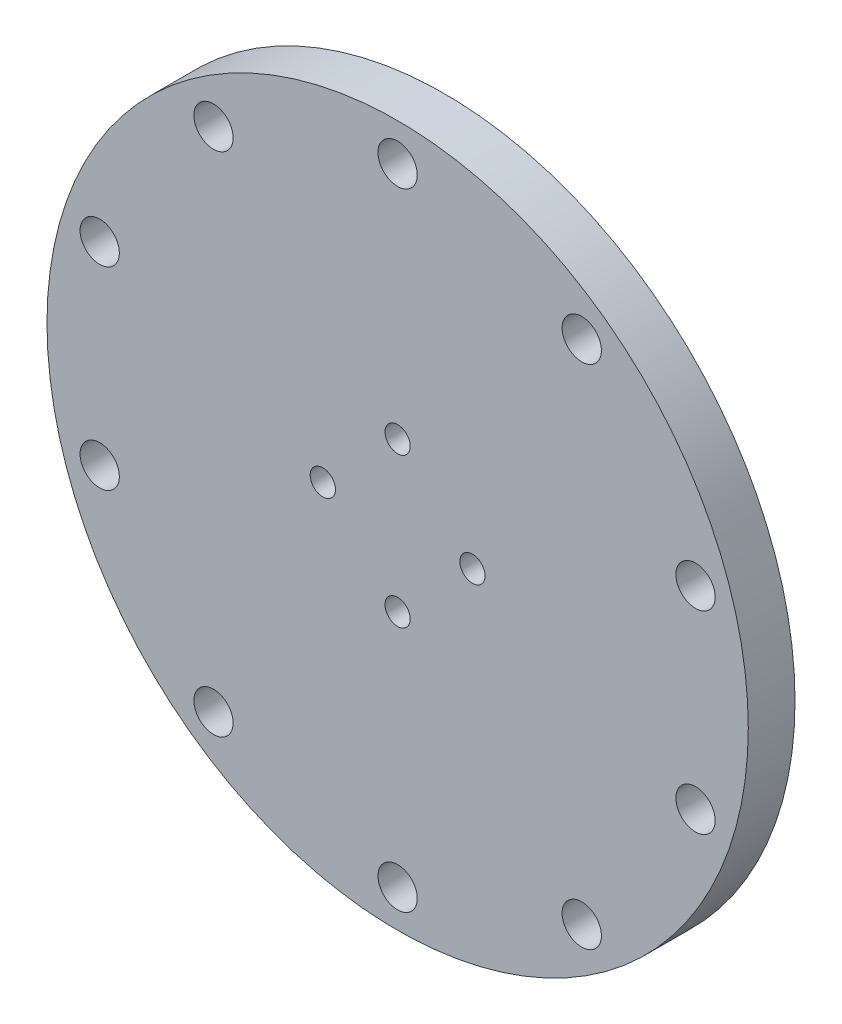
ISO-10303-21;
HEADER;
FILE_DESCRIPTION(('STEP AP214'),'2;1');
FILE_NAME('part.step','',(''),(''),'','','');
FILE_SCHEMA(('AUTOMOTIVE_DESIGN { 1 0 10303 214 1 1 1 1 }'));
ENDSEC;
DATA;
#1=APPLICATION_CONTEXT('core data for automotive mechanical design processes');
#2=APPLICATION_PROTOCOL_DEFINITION('international standard','automotive_design',2000,#1);
#3=PRODUCT_CONTEXT('',#1,'mechanical');
#4=PRODUCT('Part','Part','',(#3));
#5=PRODUCT_RELATED_PRODUCT_CATEGORY('part','',(#4));
#6=PRODUCT_DEFINITION_FORMATION('','',#4);
#7=PRODUCT_DEFINITION_CONTEXT('part definition',#1,'design');
#8=PRODUCT_DEFINITION('design','',#6,#7);
#9=PRODUCT_DEFINITION_SHAPE('','',#8);
#10=(LENGTH_UNIT() NAMED_UNIT(*) SI_UNIT(.MILLI.,.METRE.));
#11=(NAMED_UNIT(*) PLANE_ANGLE_UNIT() SI_UNIT($,.RADIAN.));
#12=(NAMED_UNIT(*) SI_UNIT($,.STERADIAN.) SOLID_ANGLE_UNIT());
#13=UNCERTAINTY_MEASURE_WITH_UNIT(LENGTH_MEASURE(1.E-05),#10,'distance_accuracy_value','');
#14=(GEOMETRIC_REPRESENTATION_CONTEXT(3) GLOBAL_UNCERTAINTY_ASSIGNED_CONTEXT((#13)) GLOBAL_UNIT_ASSIGNED_CONTEXT((#10,
#11,#12)) REPRESENTATION_CONTEXT('',''));
#15=CARTESIAN_POINT('',(0.,0.,0.));
#16=DIRECTION('',(0.,0.,1.));
#17=DIRECTION('',(1.,0.,0.));
#18=AXIS2_PLACEMENT_3D('',#15,#16,#17);
#19=CARTESIAN_POINT('',(0.,0.,0.));
#20=DIRECTION('',(0.,0.,1.));
#21=DIRECTION('',(1.,0.,0.));
#22=AXIS2_PLACEMENT_3D('',#19,#20,#21);
#23=PLANE('',#22);
#24=CARTESIAN_POINT('',(4.6785849940498E-13,0.,0.));
#25=DIRECTION('',(0.,0.,1.));
#26=DIRECTION('',(1.,0.,0.));
#27=AXIS2_PLACEMENT_3D('',#24,#25,#26);
#28=CIRCLE('',#27,23.5);
#29=CARTESIAN_POINT('',(23.5000000000005,0.,0.));
#30=VERTEX_POINT('',#29);
#31=EDGE_CURVE('E10',#30,#30,#28,.F.);
#32=ORIENTED_EDGE('',*,*,#31,.T.);
#33=EDGE_LOOP('',(#32));
#34=FACE_BOUND('',#33,.T.);
#35=CARTESIAN_POINT('',(0.,0.,0.));
#36=DIRECTION('',(0.,0.,1.));
#37=DIRECTION('',(1.,0.,0.));
#38=AXIS2_PLACEMENT_3D('',#35,#36,#37);
#39=CIRCLE('',#38,17.35);
#40=CARTESIAN_POINT('',(17.35,0.,0.));
#41=VERTEX_POINT('',#40);
#42=EDGE_CURVE('E46',#41,#41,#39,.T.);
#43=ORIENTED_EDGE('',*,*,#42,.T.);
#44=EDGE_LOOP('',(#43));
#45=FACE_BOUND('',#44,.T.);
#46=ADVANCED_FACE('F39',(#34,#45),#23,.F.);
#47=CARTESIAN_POINT('',(0.,0.,3.));
#48=DIRECTION('',(0.,0.,1.));
#49=DIRECTION('',(1.,0.,0.));
#50=AXIS2_PLACEMENT_3D('',#47,#48,#49);
#51=PLANE('',#50);
#52=CARTESIAN_POINT('',(-31.8603932958875,10.3520693115611,3.));
#53=DIRECTION('',(0.,0.,1.));
#54=DIRECTION('',(1.,0.,0.));
#55=AXIS2_PLACEMENT_3D('',#52,#53,#54);
#56=CIRCLE('',#55,2.1);
#57=CARTESIAN_POINT('',(-29.7603932958875,10.3520693115611,3.));
#58=VERTEX_POINT('',#57);
#59=EDGE_CURVE('E92',#58,#58,#56,.T.);
#60=ORIENTED_EDGE('',*,*,#59,.F.);
#61=EDGE_LOOP('',(#60));
#62=FACE_BOUND('',#61,.T.);
#63=CARTESIAN_POINT('',(-19.6908059517981,-27.1020693115606,3.));
#64=DIRECTION('',(0.,0.,1.));
#65=DIRECTION('',(1.,0.,0.));
#66=AXIS2_PLACEMENT_3D('',#63,#64,#65);
#67=CIRCLE('',#66,2.09999999999999);
#68=CARTESIAN_POINT('',(-17.5908059517981,-27.1020693115606,3.));
#69=VERTEX_POINT('',#68);
#70=EDGE_CURVE('E86',#69,#69,#67,.T.);
#71=ORIENTED_EDGE('',*,*,#70,.F.);
#72=EDGE_LOOP('',(#71));
#73=FACE_BOUND('',#72,.T.);
#74=CARTESIAN_POINT('',(19.6908059517977,-27.1020693115608,3.));
#75=DIRECTION('',(0.,0.,1.));
#76=DIRECTION('',(1.,0.,0.));
#77=AXIS2_PLACEMENT_3D('',#74,#75,#76);
#78=CIRCLE('',#77,2.09999999999999);
#79=CARTESIAN_POINT('',(21.7908059517977,-27.1020693115608,3.));
#80=VERTEX_POINT('',#79);
#81=EDGE_CURVE('E80',#80,#80,#78,.T.);
#82=ORIENTED_EDGE('',*,*,#81,.F.);
#83=EDGE_LOOP('',(#82));
#84=FACE_BOUND('',#83,.T.);
#85=CARTESIAN_POINT('',(31.8603932958878,10.3520693115602,3.));
#86=DIRECTION('',(0.,0.,1.));
#87=DIRECTION('',(1.,0.,0.));
#88=AXIS2_PLACEMENT_3D('',#85,#86,#87);
#89=CIRCLE('',#88,2.10000000000001);
#90=CARTESIAN_POINT('',(33.9603932958878,10.3520693115602,3.));
#91=VERTEX_POINT('',#90);
#92=EDGE_CURVE('E74',#91,#91,#89,.T.);
#93=ORIENTED_EDGE('',*,*,#92,.F.);
#94=EDGE_LOOP('',(#93));
#95=FACE_BOUND('',#94,.T.);
#96=CARTESIAN_POINT('',(0.,33.5,3.));
#97=DIRECTION('',(0.,0.,1.));
#98=DIRECTION('',(1.,0.,0.));
#99=AXIS2_PLACEMENT_3D('',#96,#97,#98);
#100=CIRCLE('',#99,2.1);
#101=CARTESIAN_POINT('',(2.1,33.5,3.));
#102=VERTEX_POINT('',#101);
#103=EDGE_CURVE('E68',#102,#102,#100,.T.);
#104=ORIENTED_EDGE('',*,*,#103,.F.);
#105=EDGE_LOOP('',(#104));
#106=FACE_BOUND('',#105,.T.);
#107=CARTESIAN_POINT('',(8.,0.,3.));
#108=DIRECTION('',(0.,0.,1.));
#109=DIRECTION('',(1.,0.,0.));
#110=AXIS2_PLACEMENT_3D('',#107,#108,#109);
#111=CIRCLE('',#110,1.35);
#112=CARTESIAN_POINT('',(9.35,0.,3.));
#113=VERTEX_POINT('',#112);
#114=EDGE_CURVE('E62',#113,#113,#111,.T.);
#115=ORIENTED_EDGE('',*,*,#114,.F.);
#116=EDGE_LOOP('',(#115));
#117=FACE_BOUND('',#116,.T.);
#118=CARTESIAN_POINT('',(0.,8.,3.));
#119=DIRECTION('',(0.,0.,1.));
#120=DIRECTION('',(1.,0.,0.));
#121=AXIS2_PLACEMENT_3D('',#118,#119,#120);
#122=CIRCLE('',#121,1.35);
#123=CARTESIAN_POINT('',(1.35,8.,3.));
#124=VERTEX_POINT('',#123);
#125=EDGE_CURVE('E54',#124,#124,#122,.T.);
#126=ORIENTED_EDGE('',*,*,#125,.F.);
#127=EDGE_LOOP('',(#126));
#128=FACE_BOUND('',#127,.T.);
#129=CARTESIAN_POINT('',(0.,0.,3.));
#130=DIRECTION('',(0.,0.,1.));
#131=DIRECTION('',(1.,0.,0.));
#132=AXIS2_PLACEMENT_3D('',#129,#130,#131);
#133=CIRCLE('',#132,37.5);
#134=CARTESIAN_POINT('',(37.5,0.,3.));
#135=VERTEX_POINT('',#134);
#136=EDGE_CURVE('E50',#135,#135,#133,.T.);
#137=ORIENTED_EDGE('',*,*,#136,.T.);
#138=EDGE_LOOP('',(#137));
#139=FACE_BOUND('',#138,.T.);
#140=CARTESIAN_POINT('',(0.,-8.,3.));
#141=DIRECTION('',(0.,0.,1.));
#142=DIRECTION('',(1.,0.,0.));
#143=AXIS2_PLACEMENT_3D('',#140,#141,#142);
#144=CIRCLE('',#143,1.35);
#145=CARTESIAN_POINT('',(1.35,-8.,3.));
#146=VERTEX_POINT('',#145);
#147=EDGE_CURVE('E59',#146,#146,#144,.T.);
#148=ORIENTED_EDGE('',*,*,#147,.F.);
#149=EDGE_LOOP('',(#148));
#150=FACE_BOUND('',#149,.T.);
#151=CARTESIAN_POINT('',(-8.,0.,3.));
#152=DIRECTION('',(0.,0.,1.));
#153=DIRECTION('',(1.,0.,0.));
#154=AXIS2_PLACEMENT_3D('',#151,#152,#153);
#155=CIRCLE('',#154,1.35);
#156=CARTESIAN_POINT('',(-6.65,0.,3.));
#157=VERTEX_POINT('',#156);
#158=EDGE_CURVE('E65',#157,#157,#155,.T.);
#159=ORIENTED_EDGE('',*,*,#158,.F.);
#160=EDGE_LOOP('',(#159));
#161=FACE_BOUND('',#160,.T.);
#162=CARTESIAN_POINT('',(19.6908059517983,27.1020693115605,3.));
#163=DIRECTION('',(0.,0.,1.));
#164=DIRECTION('',(1.,0.,0.));
#165=AXIS2_PLACEMENT_3D('',#162,#163,#164);
#166=CIRCLE('',#165,2.1);
#167=CARTESIAN_POINT('',(21.7908059517983,27.1020693115605,3.));
#168=VERTEX_POINT('',#167);
#169=EDGE_CURVE('E71',#168,#168,#166,.T.);
#170=ORIENTED_EDGE('',*,*,#169,.F.);
#171=EDGE_LOOP('',(#170));
#172=FACE_BOUND('',#171,.T.);
#173=CARTESIAN_POINT('',(31.8603932958876,-10.3520693115609,3.));
#174=DIRECTION('',(0.,0.,1.));
#175=DIRECTION('',(1.,0.,0.));
#176=AXIS2_PLACEMENT_3D('',#173,#174,#175);
#177=CIRCLE('',#176,2.10000000000001);
#178=CARTESIAN_POINT('',(33.9603932958876,-10.3520693115609,3.));
#179=VERTEX_POINT('',#178);
#180=EDGE_CURVE('E77',#179,#179,#177,.T.);
#181=ORIENTED_EDGE('',*,*,#180,.F.);
#182=EDGE_LOOP('',(#181));
#183=FACE_BOUND('',#182,.T.);
#184=CARTESIAN_POINT('',(-2.32452945780892E-13,-33.5,3.));
#185=DIRECTION('',(0.,0.,1.));
#186=DIRECTION('',(1.,0.,0.));
#187=AXIS2_PLACEMENT_3D('',#184,#185,#186);
#188=CIRCLE('',#187,2.09999999999999);
#189=CARTESIAN_POINT('',(2.09999999999976,-33.5,3.));
#190=VERTEX_POINT('',#189);
#191=EDGE_CURVE('E83',#190,#190,#188,.T.);
#192=ORIENTED_EDGE('',*,*,#191,.F.);
#193=EDGE_LOOP('',(#192));
#194=FACE_BOUND('',#193,.T.);
#195=CARTESIAN_POINT('',(-31.8603932958877,-10.3520693115604,3.));
#196=DIRECTION('',(0.,0.,1.));
#197=DIRECTION('',(1.,0.,0.));
#198=AXIS2_PLACEMENT_3D('',#195,#196,#197);
#199=CIRCLE('',#198,2.1);
#200=CARTESIAN_POINT('',(-29.7603932958877,-10.3520693115604,3.));
#201=VERTEX_POINT('',#200);
#202=EDGE_CURVE('E89',#201,#201,#199,.T.);
#203=ORIENTED_EDGE('',*,*,#202,.F.);
#204=EDGE_LOOP('',(#203));
#205=FACE_BOUND('',#204,.T.);
#206=CARTESIAN_POINT('',(-19.6908059517975,27.102069311561,3.));
#207=DIRECTION('',(0.,0.,1.));
#208=DIRECTION('',(1.,0.,0.));
#209=AXIS2_PLACEMENT_3D('',#206,#207,#208);
#210=CIRCLE('',#209,2.09999999999999);
#211=CARTESIAN_POINT('',(-17.5908059517975,27.102069311561,3.));
#212=VERTEX_POINT('',#211);
#213=EDGE_CURVE('E95',#212,#212,#210,.T.);
#214=ORIENTED_EDGE('',*,*,#213,.F.);
#215=EDGE_LOOP('',(#214));
#216=FACE_BOUND('',#215,.T.);
#217=ADVANCED_FACE('F173',(#62,#73,#84,#95,#106,#117,#128,#139,#150,#161,#172,#183,#194,#205,
#216),#51,.T.);
#218=CARTESIAN_POINT('',(0.,0.,3.));
#219=DIRECTION('',(0.,0.,-1.));
#220=DIRECTION('',(-1.,0.,0.));
#221=AXIS2_PLACEMENT_3D('',#218,#219,#220);
#222=CYLINDRICAL_SURFACE('',#221,37.5);
#223=ORIENTED_EDGE('',*,*,#136,.F.);
#224=EDGE_LOOP('',(#223));
#225=FACE_BOUND('',#224,.T.);
#226=CARTESIAN_POINT('',(4.6785849940498E-13,0.,-2.));
#227=DIRECTION('',(0.,0.,-1.));
#228=DIRECTION('',(-1.,0.,0.));
#229=AXIS2_PLACEMENT_3D('',#226,#227,#228);
#230=CIRCLE('',#229,37.4999999999995);
#231=CARTESIAN_POINT('',(-37.4999999999991,0.,-2.));
#232=VERTEX_POINT('',#231);
#233=EDGE_CURVE('E98',#232,#232,#230,.T.);
#234=ORIENTED_EDGE('',*,*,#233,.F.);
#235=EDGE_LOOP('',(#234));
#236=FACE_BOUND('',#235,.T.);
#237=ADVANCED_FACE('F178',(#225,#236),#222,.T.);
#238=CARTESIAN_POINT('',(0.,8.,3.));
#239=DIRECTION('',(0.,0.,-1.));
#240=DIRECTION('',(-1.,0.,0.));
#241=AXIS2_PLACEMENT_3D('',#238,#239,#240);
#242=CYLINDRICAL_SURFACE('',#241,1.35);
#243=ORIENTED_EDGE('',*,*,#125,.T.);
#244=EDGE_LOOP('',(#243));
#245=FACE_BOUND('',#244,.T.);
#246=CARTESIAN_POINT('',(0.,8.,-2.));
#247=DIRECTION('',(0.,0.,-1.));
#248=DIRECTION('',(-1.,0.,0.));
#249=AXIS2_PLACEMENT_3D('',#246,#247,#248);
#250=CIRCLE('',#249,1.35);
#251=CARTESIAN_POINT('',(-1.35,8.,-2.));
#252=VERTEX_POINT('',#251);
#253=EDGE_CURVE('E138',#252,#252,#250,.T.);
#254=ORIENTED_EDGE('',*,*,#253,.T.);
#255=EDGE_LOOP('',(#254));
#256=FACE_BOUND('',#255,.T.);
#257=ADVANCED_FACE('F150',(#245,#256),#242,.F.);
#258=CARTESIAN_POINT('',(0.,-8.,3.));
#259=DIRECTION('',(0.,0.,-1.));
#260=DIRECTION('',(-1.,0.,0.));
#261=AXIS2_PLACEMENT_3D('',#258,#259,#260);
#262=CYLINDRICAL_SURFACE('',#261,1.35);
#263=ORIENTED_EDGE('',*,*,#147,.T.);
#264=EDGE_LOOP('',(#263));
#265=FACE_BOUND('',#264,.T.);
#266=CARTESIAN_POINT('',(0.,-8.,-2.));
#267=DIRECTION('',(0.,0.,-1.));
#268=DIRECTION('',(-1.,0.,0.));
#269=AXIS2_PLACEMENT_3D('',#266,#267,#268);
#270=CIRCLE('',#269,1.35);
#271=CARTESIAN_POINT('',(-1.35,-8.,-2.));
#272=VERTEX_POINT('',#271);
#273=EDGE_CURVE('E141',#272,#272,#270,.T.);
#274=ORIENTED_EDGE('',*,*,#273,.T.);
#275=EDGE_LOOP('',(#274));
#276=FACE_BOUND('',#275,.T.);
#277=ADVANCED_FACE('F188',(#265,#276),#262,.F.);
#278=CARTESIAN_POINT('',(8.,0.,3.));
#279=DIRECTION('',(0.,0.,-1.));
#280=DIRECTION('',(-1.,0.,0.));
#281=AXIS2_PLACEMENT_3D('',#278,#279,#280);
#282=CYLINDRICAL_SURFACE('',#281,1.35);
#283=ORIENTED_EDGE('',*,*,#114,.T.);
#284=EDGE_LOOP('',(#283));
#285=FACE_BOUND('',#284,.T.);
#286=CARTESIAN_POINT('',(8.,0.,-2.));
#287=DIRECTION('',(0.,0.,-1.));
#288=DIRECTION('',(-1.,0.,0.));
#289=AXIS2_PLACEMENT_3D('',#286,#287,#288);
#290=CIRCLE('',#289,1.35);
#291=CARTESIAN_POINT('',(6.65,0.,-2.));
#292=VERTEX_POINT('',#291);
#293=EDGE_CURVE('E135',#292,#292,#290,.T.);
#294=ORIENTED_EDGE('',*,*,#293,.T.);
#295=EDGE_LOOP('',(#294));
#296=FACE_BOUND('',#295,.T.);
#297=ADVANCED_FACE('F255',(#285,#296),#282,.F.);
#298=CARTESIAN_POINT('',(-8.,0.,3.));
#299=DIRECTION('',(0.,0.,-1.));
#300=DIRECTION('',(-1.,0.,0.));
#301=AXIS2_PLACEMENT_3D('',#298,#299,#300);
#302=CYLINDRICAL_SURFACE('',#301,1.35);
#303=ORIENTED_EDGE('',*,*,#158,.T.);
#304=EDGE_LOOP('',(#303));
#305=FACE_BOUND('',#304,.T.);
#306=CARTESIAN_POINT('',(-8.,0.,-2.));
#307=DIRECTION('',(0.,0.,-1.));
#308=DIRECTION('',(-1.,0.,0.));
#309=AXIS2_PLACEMENT_3D('',#306,#307,#308);
#310=CIRCLE('',#309,1.35);
#311=CARTESIAN_POINT('',(-9.35,0.,-2.));
#312=VERTEX_POINT('',#311);
#313=EDGE_CURVE('E144',#312,#312,#310,.T.);
#314=ORIENTED_EDGE('',*,*,#313,.T.);
#315=EDGE_LOOP('',(#314));
#316=FACE_BOUND('',#315,.T.);
#317=ADVANCED_FACE('F251',(#305,#316),#302,.F.);
#318=CARTESIAN_POINT('',(0.,33.5,3.));
#319=DIRECTION('',(0.,0.,-1.));
#320=DIRECTION('',(-1.,0.,0.));
#321=AXIS2_PLACEMENT_3D('',#318,#319,#320);
#322=CYLINDRICAL_SURFACE('',#321,2.1);
#323=ORIENTED_EDGE('',*,*,#103,.T.);
#324=EDGE_LOOP('',(#323));
#325=FACE_BOUND('',#324,.T.);
#326=CARTESIAN_POINT('',(0.,33.5,-2.));
#327=DIRECTION('',(0.,0.,-1.));
#328=DIRECTION('',(-1.,0.,0.));
#329=AXIS2_PLACEMENT_3D('',#326,#327,#328);
#330=CIRCLE('',#329,2.1);
#331=CARTESIAN_POINT('',(-2.1,33.5,-2.));
#332=VERTEX_POINT('',#331);
#333=EDGE_CURVE('E119',#332,#332,#330,.T.);
#334=ORIENTED_EDGE('',*,*,#333,.T.);
#335=EDGE_LOOP('',(#334));
#336=FACE_BOUND('',#335,.T.);
#337=ADVANCED_FACE('F248',(#325,#336),#322,.F.);
#338=CARTESIAN_POINT('',(19.6908059517983,27.1020693115605,3.));
#339=DIRECTION('',(0.,0.,-1.));
#340=DIRECTION('',(-1.,0.,0.));
#341=AXIS2_PLACEMENT_3D('',#338,#339,#340);
#342=CYLINDRICAL_SURFACE('',#341,2.1);
#343=ORIENTED_EDGE('',*,*,#169,.T.);
#344=EDGE_LOOP('',(#343));
#345=FACE_BOUND('',#344,.T.);
#346=CARTESIAN_POINT('',(19.6908059517983,27.1020693115605,-2.));
#347=DIRECTION('',(0.,0.,-1.));
#348=DIRECTION('',(-1.,0.,0.));
#349=AXIS2_PLACEMENT_3D('',#346,#347,#348);
#350=CIRCLE('',#349,2.1);
#351=CARTESIAN_POINT('',(17.5908059517983,27.1020693115605,-2.));
#352=VERTEX_POINT('',#351);
#353=EDGE_CURVE('E104',#352,#352,#350,.T.);
#354=ORIENTED_EDGE('',*,*,#353,.T.);
#355=EDGE_LOOP('',(#354));
#356=FACE_BOUND('',#355,.T.);
#357=ADVANCED_FACE('F244',(#345,#356),#342,.F.);
#358=CARTESIAN_POINT('',(31.8603932958878,10.3520693115602,3.));
#359=DIRECTION('',(0.,0.,-1.));
#360=DIRECTION('',(-1.,0.,0.));
#361=AXIS2_PLACEMENT_3D('',#358,#359,#360);
#362=CYLINDRICAL_SURFACE('',#361,2.10000000000001);
#363=ORIENTED_EDGE('',*,*,#92,.T.);
#364=EDGE_LOOP('',(#363));
#365=FACE_BOUND('',#364,.T.);
#366=CARTESIAN_POINT('',(31.8603932958878,10.3520693115602,-2.));
#367=DIRECTION('',(0.,0.,-1.));
#368=DIRECTION('',(-1.,0.,0.));
#369=AXIS2_PLACEMENT_3D('',#366,#367,#368);
#370=CIRCLE('',#369,2.1);
#371=CARTESIAN_POINT('',(29.7603932958878,10.3520693115602,-2.));
#372=VERTEX_POINT('',#371);
#373=EDGE_CURVE('E107',#372,#372,#370,.T.);
#374=ORIENTED_EDGE('',*,*,#373,.T.);
#375=EDGE_LOOP('',(#374));
#376=FACE_BOUND('',#375,.T.);
#377=ADVANCED_FACE('F240',(#365,#376),#362,.F.);
#378=CARTESIAN_POINT('',(31.8603932958876,-10.3520693115609,3.));
#379=DIRECTION('',(0.,0.,-1.));
#380=DIRECTION('',(-1.,0.,0.));
#381=AXIS2_PLACEMENT_3D('',#378,#379,#380);
#382=CYLINDRICAL_SURFACE('',#381,2.10000000000001);
#383=ORIENTED_EDGE('',*,*,#180,.T.);
#384=EDGE_LOOP('',(#383));
#385=FACE_BOUND('',#384,.T.);
#386=CARTESIAN_POINT('',(31.8603932958876,-10.3520693115609,-2.));
#387=DIRECTION('',(0.,0.,-1.));
#388=DIRECTION('',(-1.,0.,0.));
#389=AXIS2_PLACEMENT_3D('',#386,#387,#388);
#390=CIRCLE('',#389,2.1);
#391=CARTESIAN_POINT('',(29.7603932958876,-10.3520693115609,-2.));
#392=VERTEX_POINT('',#391);
#393=EDGE_CURVE('E110',#392,#392,#390,.T.);
#394=ORIENTED_EDGE('',*,*,#393,.T.);
#395=EDGE_LOOP('',(#394));
#396=FACE_BOUND('',#395,.T.);
#397=ADVANCED_FACE('F236',(#385,#396),#382,.F.);
#398=CARTESIAN_POINT('',(19.6908059517977,-27.1020693115608,3.));
#399=DIRECTION('',(0.,0.,-1.));
#400=DIRECTION('',(-1.,0.,0.));
#401=AXIS2_PLACEMENT_3D('',#398,#399,#400);
#402=CYLINDRICAL_SURFACE('',#401,2.09999999999999);
#403=ORIENTED_EDGE('',*,*,#81,.T.);
#404=EDGE_LOOP('',(#403));
#405=FACE_BOUND('',#404,.T.);
#406=CARTESIAN_POINT('',(19.6908059517977,-27.1020693115608,-2.));
#407=DIRECTION('',(0.,0.,-1.));
#408=DIRECTION('',(-1.,0.,0.));
#409=AXIS2_PLACEMENT_3D('',#406,#407,#408);
#410=CIRCLE('',#409,2.1);
#411=CARTESIAN_POINT('',(17.5908059517977,-27.1020693115608,-2.));
#412=VERTEX_POINT('',#411);
#413=EDGE_CURVE('E113',#412,#412,#410,.T.);
#414=ORIENTED_EDGE('',*,*,#413,.T.);
#415=EDGE_LOOP('',(#414));
#416=FACE_BOUND('',#415,.T.);
#417=ADVANCED_FACE('F232',(#405,#416),#402,.F.);
#418=CARTESIAN_POINT('',(-2.32452945780892E-13,-33.5,3.));
#419=DIRECTION('',(0.,0.,-1.));
#420=DIRECTION('',(-1.,0.,0.));
#421=AXIS2_PLACEMENT_3D('',#418,#419,#420);
#422=CYLINDRICAL_SURFACE('',#421,2.09999999999999);
#423=ORIENTED_EDGE('',*,*,#191,.T.);
#424=EDGE_LOOP('',(#423));
#425=FACE_BOUND('',#424,.T.);
#426=CARTESIAN_POINT('',(-2.32452945780892E-13,-33.5,-2.));
#427=DIRECTION('',(0.,0.,-1.));
#428=DIRECTION('',(-1.,0.,0.));
#429=AXIS2_PLACEMENT_3D('',#426,#427,#428);
#430=CIRCLE('',#429,2.1);
#431=CARTESIAN_POINT('',(-2.10000000000023,-33.5,-2.));
#432=VERTEX_POINT('',#431);
#433=EDGE_CURVE('E116',#432,#432,#430,.T.);
#434=ORIENTED_EDGE('',*,*,#433,.T.);
#435=EDGE_LOOP('',(#434));
#436=FACE_BOUND('',#435,.T.);
#437=ADVANCED_FACE('F228',(#425,#436),#422,.F.);
#438=CARTESIAN_POINT('',(-19.6908059517981,-27.1020693115606,3.));
#439=DIRECTION('',(0.,0.,-1.));
#440=DIRECTION('',(-1.,0.,0.));
#441=AXIS2_PLACEMENT_3D('',#438,#439,#440);
#442=CYLINDRICAL_SURFACE('',#441,2.09999999999999);
#443=ORIENTED_EDGE('',*,*,#70,.T.);
#444=EDGE_LOOP('',(#443));
#445=FACE_BOUND('',#444,.T.);
#446=CARTESIAN_POINT('',(-19.6908059517981,-27.1020693115606,-2.));
#447=DIRECTION('',(0.,0.,-1.));
#448=DIRECTION('',(-1.,0.,0.));
#449=AXIS2_PLACEMENT_3D('',#446,#447,#448);
#450=CIRCLE('',#449,2.09999999999999);
#451=CARTESIAN_POINT('',(-21.7908059517981,-27.1020693115606,-2.));
#452=VERTEX_POINT('',#451);
#453=EDGE_CURVE('E122',#452,#452,#450,.T.);
#454=ORIENTED_EDGE('',*,*,#453,.T.);
#455=EDGE_LOOP('',(#454));
#456=FACE_BOUND('',#455,.T.);
#457=ADVANCED_FACE('F224',(#445,#456),#442,.F.);
#458=CARTESIAN_POINT('',(-31.8603932958877,-10.3520693115604,3.));
#459=DIRECTION('',(0.,0.,-1.));
#460=DIRECTION('',(-1.,0.,0.));
#461=AXIS2_PLACEMENT_3D('',#458,#459,#460);
#462=CYLINDRICAL_SURFACE('',#461,2.1);
#463=ORIENTED_EDGE('',*,*,#202,.T.);
#464=EDGE_LOOP('',(#463));
#465=FACE_BOUND('',#464,.T.);
#466=CARTESIAN_POINT('',(-31.8603932958877,-10.3520693115604,-2.));
#467=DIRECTION('',(0.,0.,-1.));
#468=DIRECTION('',(-1.,0.,0.));
#469=AXIS2_PLACEMENT_3D('',#466,#467,#468);
#470=CIRCLE('',#469,2.1);
#471=CARTESIAN_POINT('',(-33.9603932958877,-10.3520693115604,-2.));
#472=VERTEX_POINT('',#471);
#473=EDGE_CURVE('E125',#472,#472,#470,.T.);
#474=ORIENTED_EDGE('',*,*,#473,.T.);
#475=EDGE_LOOP('',(#474));
#476=FACE_BOUND('',#475,.T.);
#477=ADVANCED_FACE('F218',(#465,#476),#462,.F.);
#478=CARTESIAN_POINT('',(-31.8603932958875,10.3520693115611,3.));
#479=DIRECTION('',(0.,0.,-1.));
#480=DIRECTION('',(-1.,0.,0.));
#481=AXIS2_PLACEMENT_3D('',#478,#479,#480);
#482=CYLINDRICAL_SURFACE('',#481,2.1);
#483=ORIENTED_EDGE('',*,*,#59,.T.);
#484=EDGE_LOOP('',(#483));
#485=FACE_BOUND('',#484,.T.);
#486=CARTESIAN_POINT('',(-31.8603932958875,10.3520693115611,-2.));
#487=DIRECTION('',(0.,0.,-1.));
#488=DIRECTION('',(-1.,0.,0.));
#489=AXIS2_PLACEMENT_3D('',#486,#487,#488);
#490=CIRCLE('',#489,2.1);
#491=CARTESIAN_POINT('',(-33.9603932958875,10.3520693115611,-2.));
#492=VERTEX_POINT('',#491);
#493=EDGE_CURVE('E128',#492,#492,#490,.T.);
#494=ORIENTED_EDGE('',*,*,#493,.T.);
#495=EDGE_LOOP('',(#494));
#496=FACE_BOUND('',#495,.T.);
#497=ADVANCED_FACE('F212',(#485,#496),#482,.F.);
#498=CARTESIAN_POINT('',(-19.6908059517975,27.102069311561,3.));
#499=DIRECTION('',(0.,0.,-1.));
#500=DIRECTION('',(-1.,0.,0.));
#501=AXIS2_PLACEMENT_3D('',#498,#499,#500);
#502=CYLINDRICAL_SURFACE('',#501,2.09999999999999);
#503=ORIENTED_EDGE('',*,*,#213,.T.);
#504=EDGE_LOOP('',(#503));
#505=FACE_BOUND('',#504,.T.);
#506=CARTESIAN_POINT('',(-19.6908059517975,27.102069311561,-2.));
#507=DIRECTION('',(0.,0.,-1.));
#508=DIRECTION('',(-1.,0.,0.));
#509=AXIS2_PLACEMENT_3D('',#506,#507,#508);
#510=CIRCLE('',#509,2.09999999999999);
#511=CARTESIAN_POINT('',(-21.7908059517975,27.102069311561,-2.));
#512=VERTEX_POINT('',#511);
#513=EDGE_CURVE('E131',#512,#512,#510,.T.);
#514=ORIENTED_EDGE('',*,*,#513,.T.);
#515=EDGE_LOOP('',(#514));
#516=FACE_BOUND('',#515,.T.);
#517=ADVANCED_FACE('F196',(#505,#516),#502,.F.);
#518=CARTESIAN_POINT('',(4.6785849940498E-13,0.,-2.));
#519=DIRECTION('',(0.,0.,-1.));
#520=DIRECTION('',(-1.,0.,0.));
#521=AXIS2_PLACEMENT_3D('',#518,#519,#520);
#522=PLANE('',#521);
#523=ORIENTED_EDGE('',*,*,#493,.F.);
#524=EDGE_LOOP('',(#523));
#525=FACE_BOUND('',#524,.T.);
#526=ORIENTED_EDGE('',*,*,#453,.F.);
#527=EDGE_LOOP('',(#526));
#528=FACE_BOUND('',#527,.T.);
#529=ORIENTED_EDGE('',*,*,#433,.F.);
#530=EDGE_LOOP('',(#529));
#531=FACE_BOUND('',#530,.T.);
#532=ORIENTED_EDGE('',*,*,#393,.F.);
#533=EDGE_LOOP('',(#532));
#534=FACE_BOUND('',#533,.T.);
#535=ORIENTED_EDGE('',*,*,#353,.F.);
#536=EDGE_LOOP('',(#535));
#537=FACE_BOUND('',#536,.T.);
#538=ORIENTED_EDGE('',*,*,#233,.T.);
#539=EDGE_LOOP('',(#538));
#540=FACE_BOUND('',#539,.T.);
#541=CARTESIAN_POINT('',(4.6785849940498E-13,0.,-2.));
#542=DIRECTION('',(0.,0.,-1.));
#543=DIRECTION('',(-1.,0.,0.));
#544=AXIS2_PLACEMENT_3D('',#541,#542,#543);
#545=CIRCLE('',#544,29.5);
#546=CARTESIAN_POINT('',(-29.4999999999995,0.,-2.));
#547=VERTEX_POINT('',#546);
#548=EDGE_CURVE('E101',#547,#547,#545,.T.);
#549=ORIENTED_EDGE('',*,*,#548,.F.);
#550=EDGE_LOOP('',(#549));
#551=FACE_BOUND('',#550,.T.);
#552=ORIENTED_EDGE('',*,*,#373,.F.);
#553=EDGE_LOOP('',(#552));
#554=FACE_BOUND('',#553,.T.);
#555=ORIENTED_EDGE('',*,*,#413,.F.);
#556=EDGE_LOOP('',(#555));
#557=FACE_BOUND('',#556,.T.);
#558=ORIENTED_EDGE('',*,*,#333,.F.);
#559=EDGE_LOOP('',(#558));
#560=FACE_BOUND('',#559,.T.);
#561=ORIENTED_EDGE('',*,*,#473,.F.);
#562=EDGE_LOOP('',(#561));
#563=FACE_BOUND('',#562,.T.);
#564=ORIENTED_EDGE('',*,*,#513,.F.);
#565=EDGE_LOOP('',(#564));
#566=FACE_BOUND('',#565,.T.);
#567=ADVANCED_FACE('F156',(#525,#528,#531,#534,#537,#540,#551,#554,#557,#560,#563,#566),#522,.T.);
#568=CARTESIAN_POINT('',(4.6785849940498E-13,0.,-2.));
#569=DIRECTION('',(0.,0.,-1.));
#570=DIRECTION('',(-1.,0.,0.));
#571=AXIS2_PLACEMENT_3D('',#568,#569,#570);
#572=PLANE('',#571);
#573=ORIENTED_EDGE('',*,*,#293,.F.);
#574=EDGE_LOOP('',(#573));
#575=FACE_BOUND('',#574,.T.);
#576=ORIENTED_EDGE('',*,*,#253,.F.);
#577=EDGE_LOOP('',(#576));
#578=FACE_BOUND('',#577,.T.);
#579=ORIENTED_EDGE('',*,*,#313,.F.);
#580=EDGE_LOOP('',(#579));
#581=FACE_BOUND('',#580,.T.);
#582=ORIENTED_EDGE('',*,*,#273,.F.);
#583=EDGE_LOOP('',(#582));
#584=FACE_BOUND('',#583,.T.);
#585=CARTESIAN_POINT('',(0.,0.,-2.));
#586=DIRECTION('',(0.,0.,-1.));
#587=DIRECTION('',(-1.,0.,0.));
#588=AXIS2_PLACEMENT_3D('',#585,#586,#587);
#589=CIRCLE('',#588,11.35);
#590=CARTESIAN_POINT('',(-11.35,0.,-2.));
#591=VERTEX_POINT('',#590);
#592=EDGE_CURVE('E134',#591,#591,#589,.T.);
#593=ORIENTED_EDGE('',*,*,#592,.T.);
#594=EDGE_LOOP('',(#593));
#595=FACE_BOUND('',#594,.T.);
#596=ADVANCED_FACE('F152',(#575,#578,#581,#584,#595),#572,.T.);
#597=CARTESIAN_POINT('',(0.,0.,-10.));
#598=DIRECTION('',(0.,0.,1.));
#599=DIRECTION('',(1.,0.,0.));
#600=AXIS2_PLACEMENT_3D('',#597,#598,#599);
#601=TOROIDAL_SURFACE('',#600,17.35,10.);
#602=ORIENTED_EDGE('',*,*,#42,.F.);
#603=EDGE_LOOP('',(#602));
#604=FACE_BOUND('',#603,.T.);
#605=ORIENTED_EDGE('',*,*,#592,.F.);
#606=EDGE_LOOP('',(#605));
#607=FACE_BOUND('',#606,.T.);
#608=ADVANCED_FACE('F155',(#604,#607),#601,.F.);
#609=CARTESIAN_POINT('',(4.6785849940498E-13,0.,-10.));
#610=DIRECTION('',(0.,0.,-1.));
#611=DIRECTION('',(-1.,0.,0.));
#612=AXIS2_PLACEMENT_3D('',#609,#610,#611);
#613=TOROIDAL_SURFACE('',#612,23.5,10.);
#614=ORIENTED_EDGE('',*,*,#548,.T.);
#615=EDGE_LOOP('',(#614));
#616=FACE_BOUND('',#615,.T.);
#617=ORIENTED_EDGE('',*,*,#31,.F.);
#618=EDGE_LOOP('',(#617));
#619=FACE_BOUND('',#618,.T.);
#620=ADVANCED_FACE('F41',(#616,#619),#613,.F.);
#621=CLOSED_SHELL('',(#46,#217,#237,#257,#277,#297,#317,#337,#357,#377,#397,#417,#437,#457,#477,
#497,#517,#567,#596,#608,#620));
#622=MANIFOLD_SOLID_BREP('B2',#621);
#623=ADVANCED_BREP_SHAPE_REPRESENTATION('',(#18,#622),#14);
#624=SHAPE_DEFINITION_REPRESENTATION(#9,#623);
ENDSEC;
END-ISO-10303-21;
